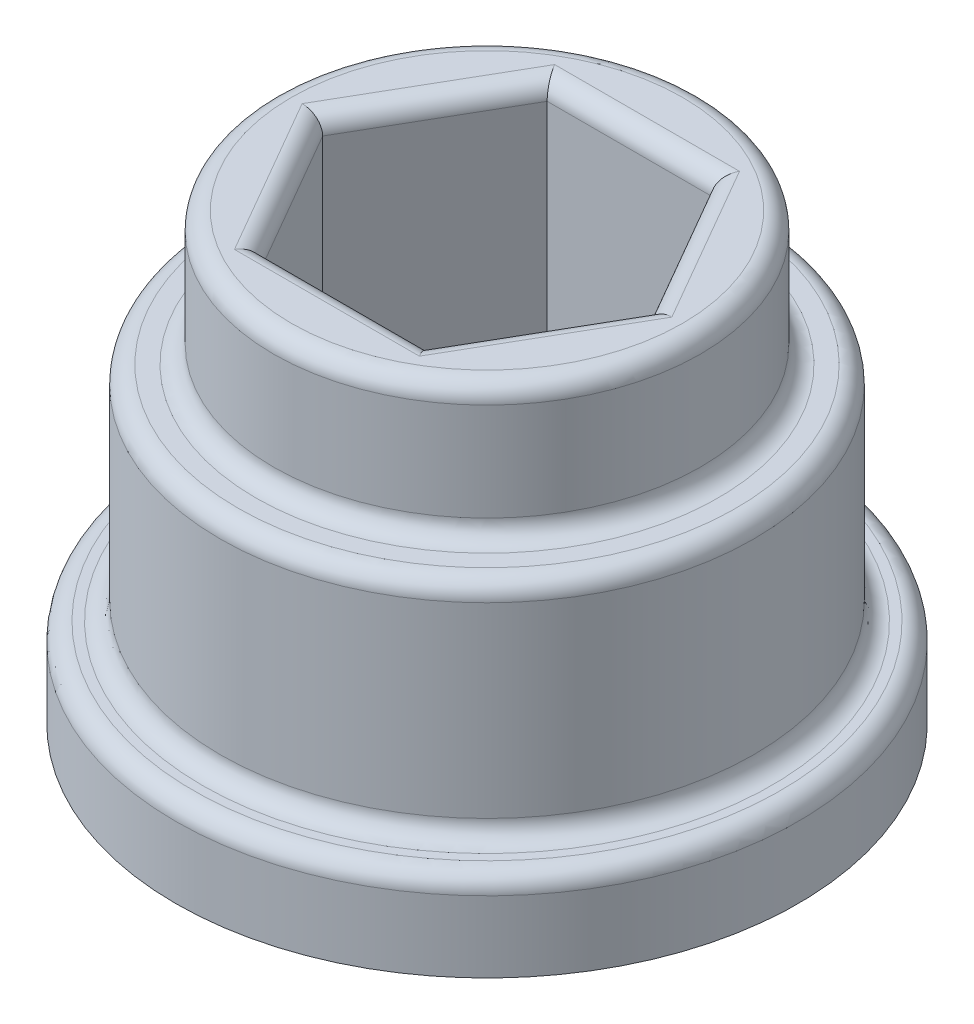
ISO-10303-21;
HEADER;
FILE_DESCRIPTION(('STEP AP214'),'2;1');
FILE_NAME('part.step','',(''),(''),'','','');
FILE_SCHEMA(('AUTOMOTIVE_DESIGN { 1 0 10303 214 1 1 1 1 }'));
ENDSEC;
DATA;
#1=APPLICATION_CONTEXT('core data for automotive mechanical design processes');
#2=APPLICATION_PROTOCOL_DEFINITION('international standard','automotive_design',2000,#1);
#3=PRODUCT_CONTEXT('',#1,'mechanical');
#4=PRODUCT('Part','Part','',(#3));
#5=PRODUCT_RELATED_PRODUCT_CATEGORY('part','',(#4));
#6=PRODUCT_DEFINITION_FORMATION('','',#4);
#7=PRODUCT_DEFINITION_CONTEXT('part definition',#1,'design');
#8=PRODUCT_DEFINITION('design','',#6,#7);
#9=PRODUCT_DEFINITION_SHAPE('','',#8);
#10=(LENGTH_UNIT() NAMED_UNIT(*) SI_UNIT(.MILLI.,.METRE.));
#11=(NAMED_UNIT(*) PLANE_ANGLE_UNIT() SI_UNIT($,.RADIAN.));
#12=(NAMED_UNIT(*) SI_UNIT($,.STERADIAN.) SOLID_ANGLE_UNIT());
#13=UNCERTAINTY_MEASURE_WITH_UNIT(LENGTH_MEASURE(1.E-05),#10,'distance_accuracy_value','');
#14=(GEOMETRIC_REPRESENTATION_CONTEXT(3) GLOBAL_UNCERTAINTY_ASSIGNED_CONTEXT((#13)) GLOBAL_UNIT_ASSIGNED_CONTEXT((#10,
#11,#12)) REPRESENTATION_CONTEXT('',''));
#15=CARTESIAN_POINT('',(0.,0.,0.));
#16=DIRECTION('',(0.,0.,1.));
#17=DIRECTION('',(1.,0.,0.));
#18=AXIS2_PLACEMENT_3D('',#15,#16,#17);
#19=CARTESIAN_POINT('',(0.,7.9375,0.));
#20=DIRECTION('',(0.,1.,0.));
#21=DIRECTION('',(0.,0.,1.));
#22=AXIS2_PLACEMENT_3D('',#19,#20,#21);
#23=PLANE('',#22);
#24=CARTESIAN_POINT('',(0.,7.9375,0.));
#25=DIRECTION('',(0.,1.,0.));
#26=DIRECTION('',(0.,0.,1.));
#27=AXIS2_PLACEMENT_3D('',#24,#25,#26);
#28=CIRCLE('',#27,8.255);
#29=CARTESIAN_POINT('',(0.,7.9375,8.255));
#30=VERTEX_POINT('',#29);
#31=EDGE_CURVE('E218',#30,#30,#28,.F.);
#32=ORIENTED_EDGE('',*,*,#31,.T.);
#33=EDGE_LOOP('',(#32));
#34=FACE_BOUND('',#33,.T.);
#35=CARTESIAN_POINT('',(0.,7.9375,0.));
#36=DIRECTION('',(0.,1.,0.));
#37=DIRECTION('',(0.,0.,1.));
#38=AXIS2_PLACEMENT_3D('',#35,#36,#37);
#39=CIRCLE('',#38,8.89);
#40=CARTESIAN_POINT('',(0.,7.9375,8.89));
#41=VERTEX_POINT('',#40);
#42=EDGE_CURVE('E215',#41,#41,#39,.T.);
#43=ORIENTED_EDGE('',*,*,#42,.T.);
#44=EDGE_LOOP('',(#43));
#45=FACE_BOUND('',#44,.T.);
#46=ADVANCED_FACE('F39',(#34,#45),#23,.T.);
#47=CARTESIAN_POINT('',(0.,7.9375,0.));
#48=DIRECTION('',(0.,-1.,0.));
#49=DIRECTION('',(0.,0.,-1.));
#50=AXIS2_PLACEMENT_3D('',#47,#48,#49);
#51=CYLINDRICAL_SURFACE('',#50,9.525);
#52=CARTESIAN_POINT('',(0.,7.3025,0.));
#53=DIRECTION('',(0.,1.,0.));
#54=DIRECTION('',(0.,0.,1.));
#55=AXIS2_PLACEMENT_3D('',#52,#53,#54);
#56=CIRCLE('',#55,9.525);
#57=CARTESIAN_POINT('',(0.,7.3025,9.525));
#58=VERTEX_POINT('',#57);
#59=EDGE_CURVE('E11',#58,#58,#56,.F.);
#60=ORIENTED_EDGE('',*,*,#59,.T.);
#61=EDGE_LOOP('',(#60));
#62=FACE_BOUND('',#61,.T.);
#63=CARTESIAN_POINT('',(0.,0.635,0.));
#64=DIRECTION('',(0.,-1.,0.));
#65=DIRECTION('',(0.,0.,-1.));
#66=AXIS2_PLACEMENT_3D('',#63,#64,#65);
#67=CIRCLE('',#66,9.525);
#68=CARTESIAN_POINT('',(0.,0.635,-9.525));
#69=VERTEX_POINT('',#68);
#70=EDGE_CURVE('E160',#69,#69,#67,.F.);
#71=ORIENTED_EDGE('',*,*,#70,.T.);
#72=EDGE_LOOP('',(#71));
#73=FACE_BOUND('',#72,.T.);
#74=ADVANCED_FACE('F240',(#62,#73),#51,.T.);
#75=CARTESIAN_POINT('',(2.9329393674833,7.9375,5.08));
#76=DIRECTION('',(-0.866025403784439,0.,-0.5));
#77=DIRECTION('',(-0.5,0.,0.866025403784439));
#78=AXIS2_PLACEMENT_3D('',#75,#76,#77);
#79=PLANE('',#78);
#80=DIRECTION('',(0.,-1.,0.));
#81=VECTOR('',#80,1.);
#82=CARTESIAN_POINT('',(2.9329393674833,7.9375,5.08));
#83=LINE('',#82,#81);
#84=CARTESIAN_POINT('',(2.9329393674833,12.065,5.08));
#85=VERTEX_POINT('',#84);
#86=CARTESIAN_POINT('',(2.9329393674833,-3.175,5.08));
#87=VERTEX_POINT('',#86);
#88=EDGE_CURVE('E152',#85,#87,#83,.T.);
#89=ORIENTED_EDGE('',*,*,#88,.F.);
#90=DIRECTION('',(0.5,0.,-0.866025403784439));
#91=VECTOR('',#90,1.);
#92=CARTESIAN_POINT('',(2.9329393674833,12.065,5.08));
#93=LINE('',#92,#91);
#94=CARTESIAN_POINT('',(5.8658787349666,12.065,0.));
#95=VERTEX_POINT('',#94);
#96=EDGE_CURVE('E189',#85,#95,#93,.T.);
#97=ORIENTED_EDGE('',*,*,#96,.T.);
#98=DIRECTION('',(0.,-1.,0.));
#99=VECTOR('',#98,1.);
#100=CARTESIAN_POINT('',(5.8658787349666,7.9375,0.));
#101=LINE('',#100,#99);
#102=CARTESIAN_POINT('',(5.8658787349666,-3.175,0.));
#103=VERTEX_POINT('',#102);
#104=EDGE_CURVE('E158',#95,#103,#101,.T.);
#105=ORIENTED_EDGE('',*,*,#104,.T.);
#106=DIRECTION('',(-0.5,0.,0.866025403784439));
#107=VECTOR('',#106,1.);
#108=CARTESIAN_POINT('',(2.9329393674833,-3.175,5.08));
#109=LINE('',#108,#107);
#110=EDGE_CURVE('E144',#103,#87,#109,.T.);
#111=ORIENTED_EDGE('',*,*,#110,.T.);
#112=EDGE_LOOP('',(#89,#97,#105,#111));
#113=FACE_BOUND('',#112,.T.);
#114=ADVANCED_FACE('F247',(#113),#79,.T.);
#115=CARTESIAN_POINT('',(5.8658787349666,7.9375,0.));
#116=DIRECTION('',(-0.866025403784438,0.,0.5));
#117=DIRECTION('',(0.5,0.,0.866025403784438));
#118=AXIS2_PLACEMENT_3D('',#115,#116,#117);
#119=PLANE('',#118);
#120=ORIENTED_EDGE('',*,*,#104,.F.);
#121=DIRECTION('',(-0.5,0.,-0.866025403784438));
#122=VECTOR('',#121,1.);
#123=CARTESIAN_POINT('',(5.8658787349666,12.065,0.));
#124=LINE('',#123,#122);
#125=CARTESIAN_POINT('',(2.9329393674833,12.065,-5.08));
#126=VERTEX_POINT('',#125);
#127=EDGE_CURVE('E62',#95,#126,#124,.T.);
#128=ORIENTED_EDGE('',*,*,#127,.T.);
#129=DIRECTION('',(0.,-1.,0.));
#130=VECTOR('',#129,1.);
#131=CARTESIAN_POINT('',(2.9329393674833,7.9375,-5.08));
#132=LINE('',#131,#130);
#133=CARTESIAN_POINT('',(2.9329393674833,-3.175,-5.08));
#134=VERTEX_POINT('',#133);
#135=EDGE_CURVE('E156',#126,#134,#132,.T.);
#136=ORIENTED_EDGE('',*,*,#135,.T.);
#137=DIRECTION('',(0.5,0.,0.866025403784438));
#138=VECTOR('',#137,1.);
#139=CARTESIAN_POINT('',(5.8658787349666,-3.175,0.));
#140=LINE('',#139,#138);
#141=EDGE_CURVE('E139',#134,#103,#140,.T.);
#142=ORIENTED_EDGE('',*,*,#141,.T.);
#143=EDGE_LOOP('',(#120,#128,#136,#142));
#144=FACE_BOUND('',#143,.T.);
#145=ADVANCED_FACE('F306',(#144),#119,.T.);
#146=CARTESIAN_POINT('',(2.9329393674833,7.9375,-5.08));
#147=DIRECTION('',(0.,0.,1.));
#148=DIRECTION('',(1.,0.,0.));
#149=AXIS2_PLACEMENT_3D('',#146,#147,#148);
#150=PLANE('',#149);
#151=ORIENTED_EDGE('',*,*,#135,.F.);
#152=DIRECTION('',(-1.,0.,0.));
#153=VECTOR('',#152,1.);
#154=CARTESIAN_POINT('',(2.9329393674833,12.065,-5.08));
#155=LINE('',#154,#153);
#156=CARTESIAN_POINT('',(-2.9329393674833,12.065,-5.08));
#157=VERTEX_POINT('',#156);
#158=EDGE_CURVE('E54',#126,#157,#155,.T.);
#159=ORIENTED_EDGE('',*,*,#158,.T.);
#160=DIRECTION('',(0.,-1.,0.));
#161=VECTOR('',#160,1.);
#162=CARTESIAN_POINT('',(-2.9329393674833,7.9375,-5.08));
#163=LINE('',#162,#161);
#164=CARTESIAN_POINT('',(-2.9329393674833,-3.175,-5.08));
#165=VERTEX_POINT('',#164);
#166=EDGE_CURVE('E122',#157,#165,#163,.T.);
#167=ORIENTED_EDGE('',*,*,#166,.T.);
#168=DIRECTION('',(1.,0.,0.));
#169=VECTOR('',#168,1.);
#170=CARTESIAN_POINT('',(2.9329393674833,-3.175,-5.08));
#171=LINE('',#170,#169);
#172=EDGE_CURVE('E137',#165,#134,#171,.T.);
#173=ORIENTED_EDGE('',*,*,#172,.T.);
#174=EDGE_LOOP('',(#151,#159,#167,#173));
#175=FACE_BOUND('',#174,.T.);
#176=ADVANCED_FACE('F307',(#175),#150,.T.);
#177=CARTESIAN_POINT('',(-2.9329393674833,7.9375,-5.08));
#178=DIRECTION('',(0.866025403784438,0.,0.5));
#179=DIRECTION('',(0.5,0.,-0.866025403784439));
#180=AXIS2_PLACEMENT_3D('',#177,#178,#179);
#181=PLANE('',#180);
#182=ORIENTED_EDGE('',*,*,#166,.F.);
#183=DIRECTION('',(-0.5,0.,0.866025403784439));
#184=VECTOR('',#183,1.);
#185=CARTESIAN_POINT('',(-2.9329393674833,12.065,-5.08));
#186=LINE('',#185,#184);
#187=CARTESIAN_POINT('',(-5.8658787349666,12.065,0.));
#188=VERTEX_POINT('',#187);
#189=EDGE_CURVE('E118',#157,#188,#186,.T.);
#190=ORIENTED_EDGE('',*,*,#189,.T.);
#191=DIRECTION('',(0.,-1.,0.));
#192=VECTOR('',#191,1.);
#193=CARTESIAN_POINT('',(-5.8658787349666,7.9375,0.));
#194=LINE('',#193,#192);
#195=CARTESIAN_POINT('',(-5.8658787349666,-3.175,0.));
#196=VERTEX_POINT('',#195);
#197=EDGE_CURVE('E111',#188,#196,#194,.T.);
#198=ORIENTED_EDGE('',*,*,#197,.T.);
#199=DIRECTION('',(0.5,0.,-0.866025403784439));
#200=VECTOR('',#199,1.);
#201=CARTESIAN_POINT('',(-2.9329393674833,-3.175,-5.08));
#202=LINE('',#201,#200);
#203=EDGE_CURVE('E115',#196,#165,#202,.T.);
#204=ORIENTED_EDGE('',*,*,#203,.T.);
#205=EDGE_LOOP('',(#182,#190,#198,#204));
#206=FACE_BOUND('',#205,.T.);
#207=ADVANCED_FACE('F113',(#206),#181,.T.);
#208=CARTESIAN_POINT('',(-5.8658787349666,7.9375,0.));
#209=DIRECTION('',(0.866025403784438,0.,-0.5));
#210=DIRECTION('',(-0.5,0.,-0.866025403784439));
#211=AXIS2_PLACEMENT_3D('',#208,#209,#210);
#212=PLANE('',#211);
#213=ORIENTED_EDGE('',*,*,#197,.F.);
#214=DIRECTION('',(0.5,0.,0.866025403784439));
#215=VECTOR('',#214,1.);
#216=CARTESIAN_POINT('',(-5.8658787349666,12.065,0.));
#217=LINE('',#216,#215);
#218=CARTESIAN_POINT('',(-2.9329393674833,12.065,5.08));
#219=VERTEX_POINT('',#218);
#220=EDGE_CURVE('E172',#188,#219,#217,.T.);
#221=ORIENTED_EDGE('',*,*,#220,.T.);
#222=DIRECTION('',(0.,-1.,0.));
#223=VECTOR('',#222,1.);
#224=CARTESIAN_POINT('',(-2.9329393674833,7.9375,5.08));
#225=LINE('',#224,#223);
#226=CARTESIAN_POINT('',(-2.9329393674833,-3.175,5.08));
#227=VERTEX_POINT('',#226);
#228=EDGE_CURVE('E123',#219,#227,#225,.T.);
#229=ORIENTED_EDGE('',*,*,#228,.T.);
#230=DIRECTION('',(-0.5,0.,-0.866025403784439));
#231=VECTOR('',#230,1.);
#232=CARTESIAN_POINT('',(-5.8658787349666,-3.175,0.));
#233=LINE('',#232,#231);
#234=EDGE_CURVE('E126',#227,#196,#233,.T.);
#235=ORIENTED_EDGE('',*,*,#234,.T.);
#236=EDGE_LOOP('',(#213,#221,#229,#235));
#237=FACE_BOUND('',#236,.T.);
#238=ADVANCED_FACE('F127',(#237),#212,.T.);
#239=CARTESIAN_POINT('',(-2.9329393674833,7.9375,5.08));
#240=DIRECTION('',(0.,0.,-1.));
#241=DIRECTION('',(-1.,0.,0.));
#242=AXIS2_PLACEMENT_3D('',#239,#240,#241);
#243=PLANE('',#242);
#244=ORIENTED_EDGE('',*,*,#228,.F.);
#245=DIRECTION('',(1.,0.,0.));
#246=VECTOR('',#245,1.);
#247=CARTESIAN_POINT('',(-2.9329393674833,12.065,5.08));
#248=LINE('',#247,#246);
#249=EDGE_CURVE('E187',#219,#85,#248,.T.);
#250=ORIENTED_EDGE('',*,*,#249,.T.);
#251=ORIENTED_EDGE('',*,*,#88,.T.);
#252=DIRECTION('',(-1.,0.,0.));
#253=VECTOR('',#252,1.);
#254=CARTESIAN_POINT('',(-2.9329393674833,-3.175,5.08));
#255=LINE('',#254,#253);
#256=EDGE_CURVE('E147',#87,#227,#255,.T.);
#257=ORIENTED_EDGE('',*,*,#256,.T.);
#258=EDGE_LOOP('',(#244,#250,#251,#257));
#259=FACE_BOUND('',#258,.T.);
#260=ADVANCED_FACE('F302',(#259),#243,.T.);
#261=CARTESIAN_POINT('',(0.,12.7,0.));
#262=DIRECTION('',(0.,1.,0.));
#263=DIRECTION('',(0.,0.,1.));
#264=AXIS2_PLACEMENT_3D('',#261,#262,#263);
#265=PLANE('',#264);
#266=CARTESIAN_POINT('',(0.,12.7,0.));
#267=DIRECTION('',(0.,1.,0.));
#268=DIRECTION('',(0.,0.,1.));
#269=AXIS2_PLACEMENT_3D('',#266,#267,#268);
#270=CIRCLE('',#269,6.985);
#271=CARTESIAN_POINT('',(0.,12.7,6.985));
#272=VERTEX_POINT('',#271);
#273=EDGE_CURVE('E47',#272,#272,#270,.T.);
#274=ORIENTED_EDGE('',*,*,#273,.T.);
#275=EDGE_LOOP('',(#274));
#276=FACE_BOUND('',#275,.T.);
#277=DIRECTION('',(1.,0.,0.));
#278=VECTOR('',#277,1.);
#279=CARTESIAN_POINT('',(0.,12.7,5.715));
#280=LINE('',#279,#278);
#281=CARTESIAN_POINT('',(3.29955678841871,12.7,5.715));
#282=VERTEX_POINT('',#281);
#283=CARTESIAN_POINT('',(-3.29955678841871,12.7,5.715));
#284=VERTEX_POINT('',#283);
#285=EDGE_CURVE('E182',#282,#284,#280,.F.);
#286=ORIENTED_EDGE('',*,*,#285,.T.);
#287=DIRECTION('',(0.5,0.,0.866025403784439));
#288=VECTOR('',#287,1.);
#289=CARTESIAN_POINT('',(-4.94933518262807,12.7,2.8575));
#290=LINE('',#289,#288);
#291=CARTESIAN_POINT('',(-6.59911357683742,12.7,0.));
#292=VERTEX_POINT('',#291);
#293=EDGE_CURVE('E184',#284,#292,#290,.F.);
#294=ORIENTED_EDGE('',*,*,#293,.T.);
#295=DIRECTION('',(-0.5,0.,0.866025403784439));
#296=VECTOR('',#295,1.);
#297=CARTESIAN_POINT('',(-4.94933518262807,12.7,-2.8575));
#298=LINE('',#297,#296);
#299=CARTESIAN_POINT('',(-3.29955678841871,12.7,-5.715));
#300=VERTEX_POINT('',#299);
#301=EDGE_CURVE('E174',#292,#300,#298,.F.);
#302=ORIENTED_EDGE('',*,*,#301,.T.);
#303=DIRECTION('',(-1.,0.,0.));
#304=VECTOR('',#303,1.);
#305=CARTESIAN_POINT('',(0.,12.7,-5.715));
#306=LINE('',#305,#304);
#307=CARTESIAN_POINT('',(3.29955678841871,12.7,-5.715));
#308=VERTEX_POINT('',#307);
#309=EDGE_CURVE('E176',#300,#308,#306,.F.);
#310=ORIENTED_EDGE('',*,*,#309,.T.);
#311=DIRECTION('',(-0.5,0.,-0.866025403784438));
#312=VECTOR('',#311,1.);
#313=CARTESIAN_POINT('',(4.94933518262807,12.7,-2.8575));
#314=LINE('',#313,#312);
#315=CARTESIAN_POINT('',(6.59911357683742,12.7,0.));
#316=VERTEX_POINT('',#315);
#317=EDGE_CURVE('E178',#308,#316,#314,.F.);
#318=ORIENTED_EDGE('',*,*,#317,.T.);
#319=DIRECTION('',(0.5,0.,-0.866025403784439));
#320=VECTOR('',#319,1.);
#321=CARTESIAN_POINT('',(4.94933518262807,12.7,2.8575));
#322=LINE('',#321,#320);
#323=EDGE_CURVE('E180',#316,#282,#322,.F.);
#324=ORIENTED_EDGE('',*,*,#323,.T.);
#325=EDGE_LOOP('',(#286,#294,#302,#310,#318,#324));
#326=FACE_BOUND('',#325,.T.);
#327=ADVANCED_FACE('F223',(#276,#326),#265,.T.);
#328=CARTESIAN_POINT('',(0.,12.7,0.));
#329=DIRECTION('',(0.,-1.,0.));
#330=DIRECTION('',(0.,0.,-1.));
#331=AXIS2_PLACEMENT_3D('',#328,#329,#330);
#332=CYLINDRICAL_SURFACE('',#331,7.62);
#333=CARTESIAN_POINT('',(0.,8.5725,0.));
#334=DIRECTION('',(0.,1.,0.));
#335=DIRECTION('',(0.,0.,1.));
#336=AXIS2_PLACEMENT_3D('',#333,#334,#335);
#337=CIRCLE('',#336,7.62);
#338=CARTESIAN_POINT('',(0.,8.5725,-7.62));
#339=VERTEX_POINT('',#338);
#340=EDGE_CURVE('E212',#339,#339,#337,.T.);
#341=CARTESIAN_POINT('',(0.,12.065,0.));
#342=DIRECTION('',(0.,1.,0.));
#343=DIRECTION('',(0.,0.,1.));
#344=AXIS2_PLACEMENT_3D('',#341,#342,#343);
#345=CIRCLE('',#344,7.62);
#346=CARTESIAN_POINT('',(0.,12.065,-7.62));
#347=VERTEX_POINT('',#346);
#348=EDGE_CURVE('E194',#347,#347,#345,.F.);
#349=CARTESIAN_POINT('',(0.,8.5725,-7.62));
#350=CARTESIAN_POINT('',(0.,8.60888020833333,-7.62));
#351=CARTESIAN_POINT('',(0.,8.64526041666667,-7.62));
#352=CARTESIAN_POINT('',(0.,8.71802083333333,-7.62));
#353=CARTESIAN_POINT('',(0.,8.75440104166667,-7.62));
#354=CARTESIAN_POINT('',(0.,8.82716145833333,-7.62));
#355=CARTESIAN_POINT('',(0.,8.86354166666666,-7.62));
#356=CARTESIAN_POINT('',(0.,8.93630208333333,-7.62));
#357=CARTESIAN_POINT('',(0.,8.97268229166666,-7.62));
#358=CARTESIAN_POINT('',(0.,9.04544270833333,-7.62));
#359=CARTESIAN_POINT('',(0.,9.08182291666667,-7.62));
#360=CARTESIAN_POINT('',(0.,9.15458333333333,-7.62));
#361=CARTESIAN_POINT('',(0.,9.19096354166667,-7.62));
#362=CARTESIAN_POINT('',(0.,9.26372395833333,-7.62));
#363=CARTESIAN_POINT('',(0.,9.30010416666667,-7.62));
#364=CARTESIAN_POINT('',(0.,9.37286458333333,-7.62));
#365=CARTESIAN_POINT('',(0.,9.40924479166667,-7.62));
#366=CARTESIAN_POINT('',(0.,9.48200520833333,-7.62));
#367=CARTESIAN_POINT('',(0.,9.51838541666667,-7.62));
#368=CARTESIAN_POINT('',(0.,9.59114583333333,-7.62));
#369=CARTESIAN_POINT('',(0.,9.62752604166667,-7.62));
#370=CARTESIAN_POINT('',(0.,9.70028645833333,-7.62));
#371=CARTESIAN_POINT('',(0.,9.73666666666667,-7.62));
#372=CARTESIAN_POINT('',(0.,9.80942708333333,-7.62));
#373=CARTESIAN_POINT('',(0.,9.84580729166666,-7.62));
#374=CARTESIAN_POINT('',(0.,9.91856770833333,-7.62));
#375=CARTESIAN_POINT('',(0.,9.95494791666667,-7.62));
#376=CARTESIAN_POINT('',(0.,10.0277083333333,-7.62));
#377=CARTESIAN_POINT('',(0.,10.0640885416667,-7.62));
#378=CARTESIAN_POINT('',(0.,10.1368489583333,-7.62));
#379=CARTESIAN_POINT('',(0.,10.1732291666667,-7.62));
#380=CARTESIAN_POINT('',(0.,10.2459895833333,-7.62));
#381=CARTESIAN_POINT('',(0.,10.2823697916667,-7.62));
#382=CARTESIAN_POINT('',(0.,10.3551302083333,-7.62));
#383=CARTESIAN_POINT('',(0.,10.3915104166667,-7.62));
#384=CARTESIAN_POINT('',(0.,10.4642708333333,-7.62));
#385=CARTESIAN_POINT('',(0.,10.5006510416667,-7.62));
#386=CARTESIAN_POINT('',(0.,10.5734114583333,-7.62));
#387=CARTESIAN_POINT('',(0.,10.6097916666667,-7.62));
#388=CARTESIAN_POINT('',(0.,10.6825520833333,-7.62));
#389=CARTESIAN_POINT('',(0.,10.7189322916667,-7.62));
#390=CARTESIAN_POINT('',(0.,10.7916927083333,-7.62));
#391=CARTESIAN_POINT('',(0.,10.8280729166667,-7.62));
#392=CARTESIAN_POINT('',(0.,10.9008333333333,-7.62));
#393=CARTESIAN_POINT('',(0.,10.9372135416667,-7.62));
#394=CARTESIAN_POINT('',(0.,11.0099739583333,-7.62));
#395=CARTESIAN_POINT('',(0.,11.0463541666667,-7.62));
#396=CARTESIAN_POINT('',(0.,11.1191145833333,-7.62));
#397=CARTESIAN_POINT('',(0.,11.1554947916667,-7.62));
#398=CARTESIAN_POINT('',(0.,11.2282552083333,-7.62));
#399=CARTESIAN_POINT('',(0.,11.2646354166667,-7.62));
#400=CARTESIAN_POINT('',(0.,11.3373958333333,-7.62));
#401=CARTESIAN_POINT('',(0.,11.3737760416667,-7.62));
#402=CARTESIAN_POINT('',(0.,11.4465364583333,-7.62));
#403=CARTESIAN_POINT('',(0.,11.4829166666667,-7.62));
#404=CARTESIAN_POINT('',(0.,11.5556770833333,-7.62));
#405=CARTESIAN_POINT('',(0.,11.5920572916667,-7.62));
#406=CARTESIAN_POINT('',(0.,11.6648177083333,-7.62));
#407=CARTESIAN_POINT('',(0.,11.7011979166667,-7.62));
#408=CARTESIAN_POINT('',(0.,11.7739583333333,-7.62));
#409=CARTESIAN_POINT('',(0.,11.8103385416667,-7.62));
#410=CARTESIAN_POINT('',(0.,11.8830989583333,-7.62));
#411=CARTESIAN_POINT('',(0.,11.9194791666667,-7.62));
#412=CARTESIAN_POINT('',(0.,11.9922395833333,-7.62));
#413=CARTESIAN_POINT('',(0.,12.0286197916667,-7.62));
#414=CARTESIAN_POINT('',(0.,12.065,-7.62));
#415=B_SPLINE_CURVE_WITH_KNOTS('',3,(#349,#350,#351,#352,#353,#354,#355,#356,#357,#358,#359,
#360,#361,#362,#363,#364,#365,#366,#367,#368,#369,#370,#371,#372,#373,#374,#375,#376,#377,#378,
#379,#380,#381,#382,#383,#384,#385,#386,#387,#388,#389,#390,#391,#392,#393,#394,#395,#396,#397,
#398,#399,#400,#401,#402,#403,#404,#405,#406,#407,#408,#409,#410,#411,#412,#413,#414),
.UNSPECIFIED.,.F.,.F.,(4,2,2,2,2,2,2,2,2,2,2,2,2,2,2,2,2,2,2,2,2,2,2,2,2,2,2,2,2,2,2,2,4),(0.,
0.109140625,0.218281249999999,0.327421874999999,0.436562499999998,0.545703124999998,
0.654843749999998,0.763984374999999,0.873124999999999,0.982265624999999,1.09140625,1.200546875,
1.3096875,1.418828125,1.52796875,1.637109375,1.74625,1.855390625,1.96453125,2.073671875,
2.1828125,2.291953125,2.40109375,2.510234375,2.619375,2.728515625,2.83765625,2.946796875,
3.0559375,3.165078125,3.27421875,3.383359375,3.4925),.UNSPECIFIED.);
#416=EDGE_CURVE('BSEAM319',#339,#347,#415,.T.);
#417=ORIENTED_EDGE('',*,*,#340,.T.);
#418=ORIENTED_EDGE('',*,*,#348,.T.);
#419=ORIENTED_EDGE('',*,*,#416,.T.);
#420=ORIENTED_EDGE('',*,*,#416,.F.);
#421=EDGE_LOOP('',(#417,#419,#418,#420));
#422=FACE_BOUND('',#421,.T.);
#423=ADVANCED_FACE('F319',(#422),#332,.T.);
#424=CARTESIAN_POINT('',(0.,-3.175,0.));
#425=DIRECTION('',(0.,-1.,0.));
#426=DIRECTION('',(0.,0.,-1.));
#427=AXIS2_PLACEMENT_3D('',#424,#425,#426);
#428=PLANE('',#427);
#429=CARTESIAN_POINT('',(0.,-3.175,0.));
#430=DIRECTION('',(0.,-1.,0.));
#431=DIRECTION('',(0.,0.,-1.));
#432=AXIS2_PLACEMENT_3D('',#429,#430,#431);
#433=CIRCLE('',#432,11.1125);
#434=CARTESIAN_POINT('',(0.,-3.175,-11.1125));
#435=VERTEX_POINT('',#434);
#436=EDGE_CURVE('E149',#435,#435,#433,.T.);
#437=ORIENTED_EDGE('',*,*,#436,.T.);
#438=EDGE_LOOP('',(#437));
#439=FACE_BOUND('',#438,.T.);
#440=ORIENTED_EDGE('',*,*,#203,.F.);
#441=ORIENTED_EDGE('',*,*,#234,.F.);
#442=ORIENTED_EDGE('',*,*,#256,.F.);
#443=ORIENTED_EDGE('',*,*,#110,.F.);
#444=ORIENTED_EDGE('',*,*,#141,.F.);
#445=ORIENTED_EDGE('',*,*,#172,.F.);
#446=EDGE_LOOP('',(#440,#441,#442,#443,#444,#445));
#447=FACE_BOUND('',#446,.T.);
#448=ADVANCED_FACE('F134',(#439,#447),#428,.T.);
#449=CARTESIAN_POINT('',(0.,0.,0.));
#450=DIRECTION('',(0.,-1.,0.));
#451=DIRECTION('',(0.,0.,-1.));
#452=AXIS2_PLACEMENT_3D('',#449,#450,#451);
#453=PLANE('',#452);
#454=CARTESIAN_POINT('',(0.,0.,0.));
#455=DIRECTION('',(0.,-1.,0.));
#456=DIRECTION('',(0.,0.,-1.));
#457=AXIS2_PLACEMENT_3D('',#454,#455,#456);
#458=CIRCLE('',#457,10.16);
#459=CARTESIAN_POINT('',(0.,0.,-10.16));
#460=VERTEX_POINT('',#459);
#461=EDGE_CURVE('E166',#460,#460,#458,.T.);
#462=ORIENTED_EDGE('',*,*,#461,.T.);
#463=EDGE_LOOP('',(#462));
#464=FACE_BOUND('',#463,.T.);
#465=CARTESIAN_POINT('',(0.,0.,0.));
#466=DIRECTION('',(0.,-1.,0.));
#467=DIRECTION('',(0.,0.,-1.));
#468=AXIS2_PLACEMENT_3D('',#465,#466,#467);
#469=CIRCLE('',#468,10.4775);
#470=CARTESIAN_POINT('',(0.,0.,-10.4775));
#471=VERTEX_POINT('',#470);
#472=EDGE_CURVE('E163',#471,#471,#469,.F.);
#473=ORIENTED_EDGE('',*,*,#472,.T.);
#474=EDGE_LOOP('',(#473));
#475=FACE_BOUND('',#474,.T.);
#476=ADVANCED_FACE('F327',(#464,#475),#453,.F.);
#477=CARTESIAN_POINT('',(0.,-3.175,0.));
#478=DIRECTION('',(0.,1.,0.));
#479=DIRECTION('',(0.,0.,1.));
#480=AXIS2_PLACEMENT_3D('',#477,#478,#479);
#481=CYLINDRICAL_SURFACE('',#480,11.1125);
#482=CARTESIAN_POINT('',(0.,-0.635,0.));
#483=DIRECTION('',(0.,-1.,0.));
#484=DIRECTION('',(0.,0.,-1.));
#485=AXIS2_PLACEMENT_3D('',#482,#483,#484);
#486=CIRCLE('',#485,11.1125);
#487=CARTESIAN_POINT('',(0.,-0.635,-11.1125));
#488=VERTEX_POINT('',#487);
#489=EDGE_CURVE('E169',#488,#488,#486,.T.);
#490=ORIENTED_EDGE('',*,*,#489,.T.);
#491=EDGE_LOOP('',(#490));
#492=FACE_BOUND('',#491,.T.);
#493=ORIENTED_EDGE('',*,*,#436,.F.);
#494=EDGE_LOOP('',(#493));
#495=FACE_BOUND('',#494,.T.);
#496=ADVANCED_FACE('F258',(#492,#495),#481,.T.);
#497=CARTESIAN_POINT('',(0.,0.635,0.));
#498=DIRECTION('',(0.,-1.,0.));
#499=DIRECTION('',(0.,0.,-1.));
#500=AXIS2_PLACEMENT_3D('',#497,#498,#499);
#501=TOROIDAL_SURFACE('',#500,10.16,0.635);
#502=ORIENTED_EDGE('',*,*,#461,.F.);
#503=EDGE_LOOP('',(#502));
#504=FACE_BOUND('',#503,.T.);
#505=ORIENTED_EDGE('',*,*,#70,.F.);
#506=EDGE_LOOP('',(#505));
#507=FACE_BOUND('',#506,.T.);
#508=ADVANCED_FACE('F254',(#504,#507),#501,.F.);
#509=CARTESIAN_POINT('',(0.,-0.635,0.));
#510=DIRECTION('',(0.,-1.,0.));
#511=DIRECTION('',(0.,0.,-1.));
#512=AXIS2_PLACEMENT_3D('',#509,#510,#511);
#513=TOROIDAL_SURFACE('',#512,10.4775,0.635);
#514=ORIENTED_EDGE('',*,*,#472,.F.);
#515=EDGE_LOOP('',(#514));
#516=FACE_BOUND('',#515,.T.);
#517=ORIENTED_EDGE('',*,*,#489,.F.);
#518=EDGE_LOOP('',(#517));
#519=FACE_BOUND('',#518,.T.);
#520=ADVANCED_FACE('F257',(#516,#519),#513,.T.);
#521=CARTESIAN_POINT('',(6.41580486636972,12.065,-0.3175));
#522=DIRECTION('',(-0.5,0.,-0.866025403784438));
#523=DIRECTION('',(-0.866025403784438,0.,0.5));
#524=AXIS2_PLACEMENT_3D('',#521,#522,#523);
#525=CYLINDRICAL_SURFACE('',#524,0.635);
#526=CARTESIAN_POINT('',(6.59911357683742,12.065,0.));
#527=DIRECTION('',(0.,0.,-1.));
#528=DIRECTION('',(1.,0.,0.));
#529=AXIS2_PLACEMENT_3D('',#526,#527,#528);
#530=ELLIPSE('',#529,0.733234841870825,0.635);
#531=EDGE_CURVE('E205',#316,#95,#530,.F.);
#532=ORIENTED_EDGE('',*,*,#531,.F.);
#533=ORIENTED_EDGE('',*,*,#317,.F.);
#534=CARTESIAN_POINT('',(3.29955678841871,12.065,-5.715));
#535=DIRECTION('',(-0.866025403784439,0.,-0.5));
#536=DIRECTION('',(0.5,0.,-0.866025403784439));
#537=AXIS2_PLACEMENT_3D('',#534,#535,#536);
#538=ELLIPSE('',#537,0.733234841870825,0.635);
#539=EDGE_CURVE('E132',#126,#308,#538,.T.);
#540=ORIENTED_EDGE('',*,*,#539,.F.);
#541=ORIENTED_EDGE('',*,*,#127,.F.);
#542=EDGE_LOOP('',(#532,#533,#540,#541));
#543=FACE_BOUND('',#542,.T.);
#544=ADVANCED_FACE('F262',(#543),#525,.T.);
#545=CARTESIAN_POINT('',(2.9329393674833,12.065,-5.715));
#546=DIRECTION('',(-1.,0.,0.));
#547=DIRECTION('',(0.,0.,1.));
#548=AXIS2_PLACEMENT_3D('',#545,#546,#547);
#549=CYLINDRICAL_SURFACE('',#548,0.635);
#550=ORIENTED_EDGE('',*,*,#539,.T.);
#551=ORIENTED_EDGE('',*,*,#309,.F.);
#552=CARTESIAN_POINT('',(-3.29955678841871,12.065,-5.715));
#553=DIRECTION('',(-0.866025403784439,0.,0.5));
#554=DIRECTION('',(-0.5,0.,-0.866025403784439));
#555=AXIS2_PLACEMENT_3D('',#552,#553,#554);
#556=ELLIPSE('',#555,0.733234841870825,0.635);
#557=EDGE_CURVE('E202',#157,#300,#556,.T.);
#558=ORIENTED_EDGE('',*,*,#557,.F.);
#559=ORIENTED_EDGE('',*,*,#158,.F.);
#560=EDGE_LOOP('',(#550,#551,#558,#559));
#561=FACE_BOUND('',#560,.T.);
#562=ADVANCED_FACE('F277',(#561),#549,.T.);
#563=CARTESIAN_POINT('',(3.48286549888642,12.065,5.3975));
#564=DIRECTION('',(0.5,0.,-0.866025403784439));
#565=DIRECTION('',(-0.866025403784439,0.,-0.5));
#566=AXIS2_PLACEMENT_3D('',#563,#564,#565);
#567=CYLINDRICAL_SURFACE('',#566,0.635);
#568=ORIENTED_EDGE('',*,*,#531,.T.);
#569=ORIENTED_EDGE('',*,*,#96,.F.);
#570=CARTESIAN_POINT('',(3.29955678841871,12.065,5.715));
#571=DIRECTION('',(0.866025403784439,0.,-0.5));
#572=DIRECTION('',(0.5,0.,0.866025403784439));
#573=AXIS2_PLACEMENT_3D('',#570,#571,#572);
#574=ELLIPSE('',#573,0.733234841870825,0.635);
#575=EDGE_CURVE('E199',#282,#85,#574,.F.);
#576=ORIENTED_EDGE('',*,*,#575,.F.);
#577=ORIENTED_EDGE('',*,*,#323,.F.);
#578=EDGE_LOOP('',(#568,#569,#576,#577));
#579=FACE_BOUND('',#578,.T.);
#580=ADVANCED_FACE('F273',(#579),#567,.T.);
#581=CARTESIAN_POINT('',(-3.48286549888642,12.065,-5.3975));
#582=DIRECTION('',(-0.5,0.,0.866025403784439));
#583=DIRECTION('',(0.866025403784438,0.,0.5));
#584=AXIS2_PLACEMENT_3D('',#581,#582,#583);
#585=CYLINDRICAL_SURFACE('',#584,0.635);
#586=ORIENTED_EDGE('',*,*,#557,.T.);
#587=ORIENTED_EDGE('',*,*,#301,.F.);
#588=CARTESIAN_POINT('',(-6.59911357683742,12.065,0.));
#589=DIRECTION('',(0.,0.,1.));
#590=DIRECTION('',(1.,0.,0.));
#591=AXIS2_PLACEMENT_3D('',#588,#589,#590);
#592=ELLIPSE('',#591,0.733234841870825,0.635);
#593=EDGE_CURVE('E197',#188,#292,#592,.T.);
#594=ORIENTED_EDGE('',*,*,#593,.F.);
#595=ORIENTED_EDGE('',*,*,#189,.F.);
#596=EDGE_LOOP('',(#586,#587,#594,#595));
#597=FACE_BOUND('',#596,.T.);
#598=ADVANCED_FACE('F269',(#597),#585,.T.);
#599=CARTESIAN_POINT('',(-2.9329393674833,12.065,5.715));
#600=DIRECTION('',(1.,0.,0.));
#601=DIRECTION('',(0.,0.,-1.));
#602=AXIS2_PLACEMENT_3D('',#599,#600,#601);
#603=CYLINDRICAL_SURFACE('',#602,0.635);
#604=ORIENTED_EDGE('',*,*,#575,.T.);
#605=ORIENTED_EDGE('',*,*,#249,.F.);
#606=CARTESIAN_POINT('',(-3.29955678841871,12.065,5.715));
#607=DIRECTION('',(0.866025403784439,0.,0.5));
#608=DIRECTION('',(-0.5,0.,0.866025403784439));
#609=AXIS2_PLACEMENT_3D('',#606,#607,#608);
#610=ELLIPSE('',#609,0.733234841870825,0.635);
#611=EDGE_CURVE('E195',#284,#219,#610,.F.);
#612=ORIENTED_EDGE('',*,*,#611,.F.);
#613=ORIENTED_EDGE('',*,*,#285,.F.);
#614=EDGE_LOOP('',(#604,#605,#612,#613));
#615=FACE_BOUND('',#614,.T.);
#616=ADVANCED_FACE('F265',(#615),#603,.T.);
#617=CARTESIAN_POINT('',(-6.41580486636972,12.065,0.317499999999997));
#618=DIRECTION('',(0.5,0.,0.866025403784439));
#619=DIRECTION('',(0.866025403784438,0.,-0.5));
#620=AXIS2_PLACEMENT_3D('',#617,#618,#619);
#621=CYLINDRICAL_SURFACE('',#620,0.635);
#622=ORIENTED_EDGE('',*,*,#593,.T.);
#623=ORIENTED_EDGE('',*,*,#293,.F.);
#624=ORIENTED_EDGE('',*,*,#611,.T.);
#625=ORIENTED_EDGE('',*,*,#220,.F.);
#626=EDGE_LOOP('',(#622,#623,#624,#625));
#627=FACE_BOUND('',#626,.T.);
#628=ADVANCED_FACE('F235',(#627),#621,.T.);
#629=CARTESIAN_POINT('',(0.,8.5725,0.));
#630=DIRECTION('',(0.,1.,0.));
#631=DIRECTION('',(0.,0.,1.));
#632=AXIS2_PLACEMENT_3D('',#629,#630,#631);
#633=TOROIDAL_SURFACE('',#632,8.255,0.635);
#634=ORIENTED_EDGE('',*,*,#31,.F.);
#635=EDGE_LOOP('',(#634));
#636=FACE_BOUND('',#635,.T.);
#637=ORIENTED_EDGE('',*,*,#340,.F.);
#638=EDGE_LOOP('',(#637));
#639=FACE_BOUND('',#638,.T.);
#640=ADVANCED_FACE('F228',(#636,#639),#633,.F.);
#641=CARTESIAN_POINT('',(0.,12.065,0.));
#642=DIRECTION('',(0.,1.,0.));
#643=DIRECTION('',(0.,0.,1.));
#644=AXIS2_PLACEMENT_3D('',#641,#642,#643);
#645=TOROIDAL_SURFACE('',#644,6.985,0.635);
#646=ORIENTED_EDGE('',*,*,#348,.F.);
#647=EDGE_LOOP('',(#646));
#648=FACE_BOUND('',#647,.T.);
#649=ORIENTED_EDGE('',*,*,#273,.F.);
#650=EDGE_LOOP('',(#649));
#651=FACE_BOUND('',#650,.T.);
#652=ADVANCED_FACE('F226',(#648,#651),#645,.T.);
#653=CARTESIAN_POINT('',(0.,7.3025,0.));
#654=DIRECTION('',(0.,1.,0.));
#655=DIRECTION('',(0.,0.,1.));
#656=AXIS2_PLACEMENT_3D('',#653,#654,#655);
#657=TOROIDAL_SURFACE('',#656,8.89,0.635);
#658=ORIENTED_EDGE('',*,*,#59,.F.);
#659=EDGE_LOOP('',(#658));
#660=FACE_BOUND('',#659,.T.);
#661=ORIENTED_EDGE('',*,*,#42,.F.);
#662=EDGE_LOOP('',(#661));
#663=FACE_BOUND('',#662,.T.);
#664=ADVANCED_FACE('F41',(#660,#663),#657,.T.);
#665=CLOSED_SHELL('',(#46,#74,#114,#145,#176,#207,#238,#260,#327,#423,#448,#476,#496,#508,#520,
#544,#562,#580,#598,#616,#628,#640,#652,#664));
#666=MANIFOLD_SOLID_BREP('B2',#665);
#667=ADVANCED_BREP_SHAPE_REPRESENTATION('',(#18,#666),#14);
#668=SHAPE_DEFINITION_REPRESENTATION(#9,#667);
ENDSEC;
END-ISO-10303-21;
